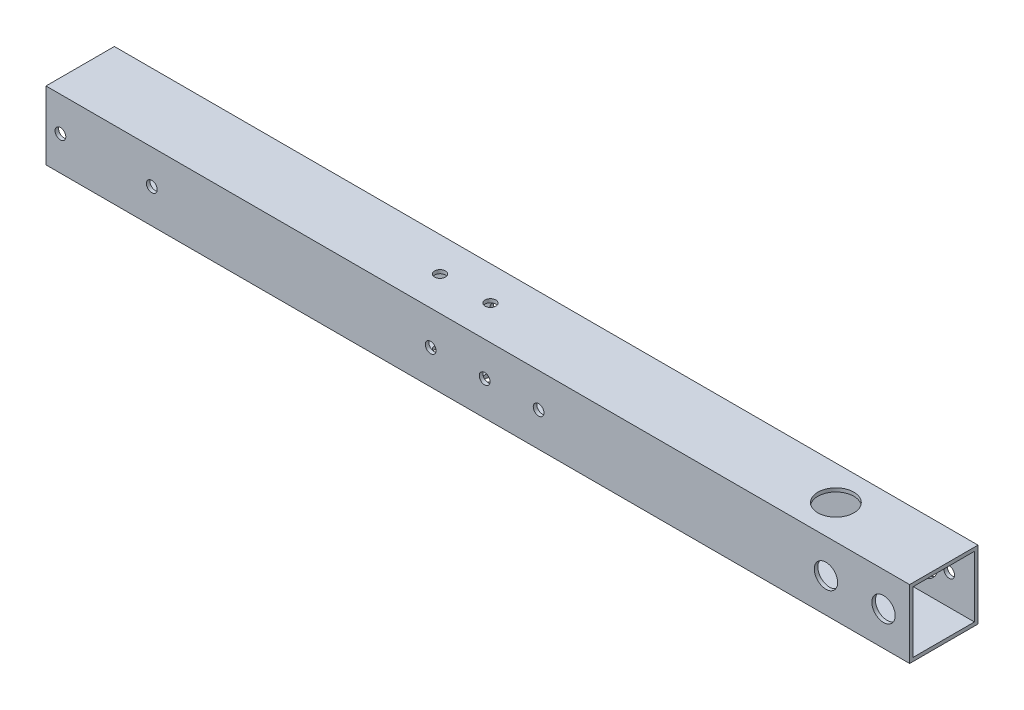
ISO-10303-21;
HEADER;
FILE_DESCRIPTION(('STEP AP214'),'2;1');
FILE_NAME('part.step','',(''),(''),'','','');
FILE_SCHEMA(('AUTOMOTIVE_DESIGN { 1 0 10303 214 1 1 1 1 }'));
ENDSEC;
DATA;
#1=APPLICATION_CONTEXT('core data for automotive mechanical design processes');
#2=APPLICATION_PROTOCOL_DEFINITION('international standard','automotive_design',2000,#1);
#3=PRODUCT_CONTEXT('',#1,'mechanical');
#4=PRODUCT('Part','Part','',(#3));
#5=PRODUCT_RELATED_PRODUCT_CATEGORY('part','',(#4));
#6=PRODUCT_DEFINITION_FORMATION('','',#4);
#7=PRODUCT_DEFINITION_CONTEXT('part definition',#1,'design');
#8=PRODUCT_DEFINITION('design','',#6,#7);
#9=PRODUCT_DEFINITION_SHAPE('','',#8);
#10=(LENGTH_UNIT() NAMED_UNIT(*) SI_UNIT(.MILLI.,.METRE.));
#11=(NAMED_UNIT(*) PLANE_ANGLE_UNIT() SI_UNIT($,.RADIAN.));
#12=(NAMED_UNIT(*) SI_UNIT($,.STERADIAN.) SOLID_ANGLE_UNIT());
#13=UNCERTAINTY_MEASURE_WITH_UNIT(LENGTH_MEASURE(1.E-05),#10,'distance_accuracy_value','');
#14=(GEOMETRIC_REPRESENTATION_CONTEXT(3) GLOBAL_UNCERTAINTY_ASSIGNED_CONTEXT((#13)) GLOBAL_UNIT_ASSIGNED_CONTEXT((#10,
#11,#12)) REPRESENTATION_CONTEXT('',''));
#15=CARTESIAN_POINT('',(0.,0.,0.));
#16=DIRECTION('',(0.,0.,1.));
#17=DIRECTION('',(1.,0.,0.));
#18=AXIS2_PLACEMENT_3D('',#15,#16,#17);
#19=CARTESIAN_POINT('',(240.,0.,0.));
#20=DIRECTION('',(-1.,0.,0.));
#21=DIRECTION('',(0.,0.,1.));
#22=AXIS2_PLACEMENT_3D('',#19,#20,#21);
#23=PLANE('',#22);
#24=DIRECTION('',(0.,1.,0.));
#25=VECTOR('',#24,1.);
#26=CARTESIAN_POINT('',(240.,-9.5,-9.5));
#27=LINE('',#26,#25);
#28=CARTESIAN_POINT('',(240.,-9.5,-9.5));
#29=VERTEX_POINT('',#28);
#30=CARTESIAN_POINT('',(240.,9.5,-9.5));
#31=VERTEX_POINT('',#30);
#32=EDGE_CURVE('E139',#29,#31,#27,.T.);
#33=ORIENTED_EDGE('',*,*,#32,.T.);
#34=DIRECTION('',(0.,0.,1.));
#35=VECTOR('',#34,1.);
#36=CARTESIAN_POINT('',(240.,9.5,9.5));
#37=LINE('',#36,#35);
#38=CARTESIAN_POINT('',(240.,9.5,9.5));
#39=VERTEX_POINT('',#38);
#40=EDGE_CURVE('E142',#31,#39,#37,.T.);
#41=ORIENTED_EDGE('',*,*,#40,.T.);
#42=DIRECTION('',(0.,-1.,0.));
#43=VECTOR('',#42,1.);
#44=CARTESIAN_POINT('',(240.,-9.5,9.5));
#45=LINE('',#44,#43);
#46=CARTESIAN_POINT('',(240.,-9.5,9.5));
#47=VERTEX_POINT('',#46);
#48=EDGE_CURVE('E145',#39,#47,#45,.T.);
#49=ORIENTED_EDGE('',*,*,#48,.T.);
#50=DIRECTION('',(0.,0.,-1.));
#51=VECTOR('',#50,1.);
#52=CARTESIAN_POINT('',(240.,-9.5,9.5));
#53=LINE('',#52,#51);
#54=EDGE_CURVE('E147',#47,#29,#53,.T.);
#55=ORIENTED_EDGE('',*,*,#54,.T.);
#56=EDGE_LOOP('',(#33,#41,#49,#55));
#57=FACE_BOUND('',#56,.T.);
#58=DIRECTION('',(0.,-1.,0.));
#59=VECTOR('',#58,1.);
#60=CARTESIAN_POINT('',(240.,-8.5,8.5));
#61=LINE('',#60,#59);
#62=CARTESIAN_POINT('',(240.,8.5,8.5));
#63=VERTEX_POINT('',#62);
#64=CARTESIAN_POINT('',(240.,-8.5,8.5));
#65=VERTEX_POINT('',#64);
#66=EDGE_CURVE('E101',#63,#65,#61,.T.);
#67=ORIENTED_EDGE('',*,*,#66,.F.);
#68=DIRECTION('',(0.,0.,1.));
#69=VECTOR('',#68,1.);
#70=CARTESIAN_POINT('',(240.,8.5,8.5));
#71=LINE('',#70,#69);
#72=CARTESIAN_POINT('',(240.,8.5,-8.5));
#73=VERTEX_POINT('',#72);
#74=EDGE_CURVE('E123',#73,#63,#71,.T.);
#75=ORIENTED_EDGE('',*,*,#74,.F.);
#76=DIRECTION('',(0.,1.,0.));
#77=VECTOR('',#76,1.);
#78=CARTESIAN_POINT('',(240.,-8.5,-8.5));
#79=LINE('',#78,#77);
#80=CARTESIAN_POINT('',(240.,-8.5,-8.5));
#81=VERTEX_POINT('',#80);
#82=EDGE_CURVE('E121',#81,#73,#79,.T.);
#83=ORIENTED_EDGE('',*,*,#82,.F.);
#84=DIRECTION('',(0.,0.,-1.));
#85=VECTOR('',#84,1.);
#86=CARTESIAN_POINT('',(240.,-8.5,8.5));
#87=LINE('',#86,#85);
#88=EDGE_CURVE('E109',#65,#81,#87,.T.);
#89=ORIENTED_EDGE('',*,*,#88,.F.);
#90=EDGE_LOOP('',(#67,#75,#83,#89));
#91=FACE_BOUND('',#90,.T.);
#92=ADVANCED_FACE('F34',(#57,#91),#23,.F.);
#93=CARTESIAN_POINT('',(0.,0.,0.));
#94=DIRECTION('',(-1.,0.,0.));
#95=DIRECTION('',(0.,0.,1.));
#96=AXIS2_PLACEMENT_3D('',#93,#94,#95);
#97=PLANE('',#96);
#98=DIRECTION('',(0.,1.,0.));
#99=VECTOR('',#98,1.);
#100=CARTESIAN_POINT('',(0.,-9.5,-9.5));
#101=LINE('',#100,#99);
#102=CARTESIAN_POINT('',(0.,-9.5,-9.5));
#103=VERTEX_POINT('',#102);
#104=CARTESIAN_POINT('',(0.,9.5,-9.5));
#105=VERTEX_POINT('',#104);
#106=EDGE_CURVE('E117',#103,#105,#101,.T.);
#107=ORIENTED_EDGE('',*,*,#106,.F.);
#108=DIRECTION('',(0.,0.,-1.));
#109=VECTOR('',#108,1.);
#110=CARTESIAN_POINT('',(0.,-9.5,9.5));
#111=LINE('',#110,#109);
#112=CARTESIAN_POINT('',(0.,-9.5,9.5));
#113=VERTEX_POINT('',#112);
#114=EDGE_CURVE('E143',#113,#103,#111,.T.);
#115=ORIENTED_EDGE('',*,*,#114,.F.);
#116=DIRECTION('',(0.,-1.,0.));
#117=VECTOR('',#116,1.);
#118=CARTESIAN_POINT('',(0.,-9.5,9.5));
#119=LINE('',#118,#117);
#120=CARTESIAN_POINT('',(0.,9.5,9.5));
#121=VERTEX_POINT('',#120);
#122=EDGE_CURVE('E154',#121,#113,#119,.T.);
#123=ORIENTED_EDGE('',*,*,#122,.F.);
#124=DIRECTION('',(0.,0.,1.));
#125=VECTOR('',#124,1.);
#126=CARTESIAN_POINT('',(0.,9.5,9.5));
#127=LINE('',#126,#125);
#128=EDGE_CURVE('E152',#105,#121,#127,.T.);
#129=ORIENTED_EDGE('',*,*,#128,.F.);
#130=EDGE_LOOP('',(#107,#115,#123,#129));
#131=FACE_BOUND('',#130,.T.);
#132=DIRECTION('',(0.,0.,1.));
#133=VECTOR('',#132,1.);
#134=CARTESIAN_POINT('',(0.,8.5,8.5));
#135=LINE('',#134,#133);
#136=CARTESIAN_POINT('',(0.,8.5,-8.5));
#137=VERTEX_POINT('',#136);
#138=CARTESIAN_POINT('',(0.,8.5,8.5));
#139=VERTEX_POINT('',#138);
#140=EDGE_CURVE('E110',#137,#139,#135,.T.);
#141=ORIENTED_EDGE('',*,*,#140,.T.);
#142=DIRECTION('',(0.,-1.,0.));
#143=VECTOR('',#142,1.);
#144=CARTESIAN_POINT('',(0.,-8.5,8.5));
#145=LINE('',#144,#143);
#146=CARTESIAN_POINT('',(0.,-8.5,8.5));
#147=VERTEX_POINT('',#146);
#148=EDGE_CURVE('E59',#139,#147,#145,.T.);
#149=ORIENTED_EDGE('',*,*,#148,.T.);
#150=DIRECTION('',(0.,0.,-1.));
#151=VECTOR('',#150,1.);
#152=CARTESIAN_POINT('',(0.,-8.5,8.5));
#153=LINE('',#152,#151);
#154=CARTESIAN_POINT('',(0.,-8.5,-8.5));
#155=VERTEX_POINT('',#154);
#156=EDGE_CURVE('E116',#147,#155,#153,.T.);
#157=ORIENTED_EDGE('',*,*,#156,.T.);
#158=DIRECTION('',(0.,1.,0.));
#159=VECTOR('',#158,1.);
#160=CARTESIAN_POINT('',(0.,-8.5,-8.5));
#161=LINE('',#160,#159);
#162=EDGE_CURVE('E131',#155,#137,#161,.T.);
#163=ORIENTED_EDGE('',*,*,#162,.T.);
#164=EDGE_LOOP('',(#141,#149,#157,#163));
#165=FACE_BOUND('',#164,.T.);
#166=ADVANCED_FACE('F304',(#131,#165),#97,.T.);
#167=CARTESIAN_POINT('',(240.,-9.5,-9.5));
#168=DIRECTION('',(0.,0.,1.));
#169=DIRECTION('',(1.,0.,0.));
#170=AXIS2_PLACEMENT_3D('',#167,#168,#169);
#171=PLANE('',#170);
#172=CARTESIAN_POINT('',(233.,0.,-9.5));
#173=DIRECTION('',(0.,0.,-1.));
#174=DIRECTION('',(-1.,0.,0.));
#175=AXIS2_PLACEMENT_3D('',#172,#173,#174);
#176=CIRCLE('',#175,1.5);
#177=CARTESIAN_POINT('',(231.5,0.,-9.5));
#178=VERTEX_POINT('',#177);
#179=EDGE_CURVE('E226',#178,#178,#176,.T.);
#180=ORIENTED_EDGE('',*,*,#179,.F.);
#181=EDGE_LOOP('',(#180));
#182=FACE_BOUND('',#181,.T.);
#183=CARTESIAN_POINT('',(217.,0.,-9.5));
#184=DIRECTION('',(0.,0.,-1.));
#185=DIRECTION('',(-1.,0.,0.));
#186=AXIS2_PLACEMENT_3D('',#183,#184,#185);
#187=CIRCLE('',#186,1.5);
#188=CARTESIAN_POINT('',(215.5,0.,-9.5));
#189=VERTEX_POINT('',#188);
#190=EDGE_CURVE('E216',#189,#189,#187,.T.);
#191=ORIENTED_EDGE('',*,*,#190,.F.);
#192=EDGE_LOOP('',(#191));
#193=FACE_BOUND('',#192,.T.);
#194=CARTESIAN_POINT('',(225.,0.,-9.5));
#195=DIRECTION('',(0.,0.,-1.));
#196=DIRECTION('',(-1.,0.,0.));
#197=AXIS2_PLACEMENT_3D('',#194,#195,#196);
#198=CIRCLE('',#197,4.99999999999999);
#199=CARTESIAN_POINT('',(220.,0.,-9.5));
#200=VERTEX_POINT('',#199);
#201=EDGE_CURVE('E213',#200,#200,#198,.T.);
#202=ORIENTED_EDGE('',*,*,#201,.F.);
#203=EDGE_LOOP('',(#202));
#204=FACE_BOUND('',#203,.T.);
#205=CARTESIAN_POINT('',(136.9,0.,-9.5));
#206=DIRECTION('',(0.,0.,1.));
#207=DIRECTION('',(1.,0.,0.));
#208=AXIS2_PLACEMENT_3D('',#205,#206,#207);
#209=CIRCLE('',#208,1.5);
#210=CARTESIAN_POINT('',(138.4,0.,-9.5));
#211=VERTEX_POINT('',#210);
#212=EDGE_CURVE('E187',#211,#211,#209,.T.);
#213=ORIENTED_EDGE('',*,*,#212,.T.);
#214=EDGE_LOOP('',(#213));
#215=FACE_BOUND('',#214,.T.);
#216=CARTESIAN_POINT('',(121.9,0.,-9.5));
#217=DIRECTION('',(0.,0.,1.));
#218=DIRECTION('',(1.,0.,0.));
#219=AXIS2_PLACEMENT_3D('',#216,#217,#218);
#220=CIRCLE('',#219,1.5);
#221=CARTESIAN_POINT('',(123.4,0.,-9.5));
#222=VERTEX_POINT('',#221);
#223=EDGE_CURVE('E182',#222,#222,#220,.T.);
#224=ORIENTED_EDGE('',*,*,#223,.T.);
#225=EDGE_LOOP('',(#224));
#226=FACE_BOUND('',#225,.T.);
#227=CARTESIAN_POINT('',(29.4,0.,-9.5));
#228=DIRECTION('',(0.,0.,1.));
#229=DIRECTION('',(1.,0.,0.));
#230=AXIS2_PLACEMENT_3D('',#227,#228,#229);
#231=CIRCLE('',#230,1.5);
#232=CARTESIAN_POINT('',(30.9,0.,-9.5));
#233=VERTEX_POINT('',#232);
#234=EDGE_CURVE('E177',#233,#233,#231,.T.);
#235=ORIENTED_EDGE('',*,*,#234,.T.);
#236=EDGE_LOOP('',(#235));
#237=FACE_BOUND('',#236,.T.);
#238=CARTESIAN_POINT('',(106.9,0.,-9.5));
#239=DIRECTION('',(0.,0.,1.));
#240=DIRECTION('',(1.,0.,0.));
#241=AXIS2_PLACEMENT_3D('',#238,#239,#240);
#242=CIRCLE('',#241,1.5);
#243=CARTESIAN_POINT('',(108.4,0.,-9.5));
#244=VERTEX_POINT('',#243);
#245=EDGE_CURVE('E172',#244,#244,#242,.T.);
#246=ORIENTED_EDGE('',*,*,#245,.T.);
#247=EDGE_LOOP('',(#246));
#248=FACE_BOUND('',#247,.T.);
#249=CARTESIAN_POINT('',(4.,0.,-9.5));
#250=DIRECTION('',(0.,0.,1.));
#251=DIRECTION('',(1.,0.,0.));
#252=AXIS2_PLACEMENT_3D('',#249,#250,#251);
#253=CIRCLE('',#252,1.5);
#254=CARTESIAN_POINT('',(5.5,0.,-9.5));
#255=VERTEX_POINT('',#254);
#256=EDGE_CURVE('E167',#255,#255,#253,.T.);
#257=ORIENTED_EDGE('',*,*,#256,.T.);
#258=EDGE_LOOP('',(#257));
#259=FACE_BOUND('',#258,.T.);
#260=ORIENTED_EDGE('',*,*,#106,.T.);
#261=DIRECTION('',(-1.,0.,0.));
#262=VECTOR('',#261,1.);
#263=CARTESIAN_POINT('',(240.,9.5,-9.5));
#264=LINE('',#263,#262);
#265=EDGE_CURVE('E11',#31,#105,#264,.T.);
#266=ORIENTED_EDGE('',*,*,#265,.F.);
#267=ORIENTED_EDGE('',*,*,#32,.F.);
#268=DIRECTION('',(-1.,0.,0.));
#269=VECTOR('',#268,1.);
#270=CARTESIAN_POINT('',(240.,-9.5,-9.5));
#271=LINE('',#270,#269);
#272=EDGE_CURVE('E149',#29,#103,#271,.T.);
#273=ORIENTED_EDGE('',*,*,#272,.T.);
#274=EDGE_LOOP('',(#260,#266,#267,#273));
#275=FACE_BOUND('',#274,.T.);
#276=ADVANCED_FACE('F36',(#182,#193,#204,#215,#226,#237,#248,#259,#275),#171,.F.);
#277=CARTESIAN_POINT('',(240.,9.5,9.5));
#278=DIRECTION('',(0.,-1.,0.));
#279=DIRECTION('',(0.,0.,-1.));
#280=AXIS2_PLACEMENT_3D('',#277,#278,#279);
#281=PLANE('',#280);
#282=CARTESIAN_POINT('',(210.,9.5,0.));
#283=DIRECTION('',(0.,1.,0.));
#284=DIRECTION('',(0.,0.,1.));
#285=AXIS2_PLACEMENT_3D('',#282,#283,#284);
#286=CIRCLE('',#285,4.99999999999999);
#287=CARTESIAN_POINT('',(210.,9.5,4.99999999999999));
#288=VERTEX_POINT('',#287);
#289=EDGE_CURVE('E202',#288,#288,#286,.T.);
#290=ORIENTED_EDGE('',*,*,#289,.F.);
#291=EDGE_LOOP('',(#290));
#292=FACE_BOUND('',#291,.T.);
#293=CARTESIAN_POINT('',(114.,9.5,0.));
#294=DIRECTION('',(0.,1.,0.));
#295=DIRECTION('',(0.,0.,1.));
#296=AXIS2_PLACEMENT_3D('',#293,#294,#295);
#297=CIRCLE('',#296,1.5);
#298=CARTESIAN_POINT('',(114.,9.5,1.50000000000001));
#299=VERTEX_POINT('',#298);
#300=EDGE_CURVE('E201',#299,#299,#297,.T.);
#301=ORIENTED_EDGE('',*,*,#300,.F.);
#302=EDGE_LOOP('',(#301));
#303=FACE_BOUND('',#302,.T.);
#304=CARTESIAN_POINT('',(100.,9.5,0.));
#305=DIRECTION('',(0.,1.,0.));
#306=DIRECTION('',(0.,0.,1.));
#307=AXIS2_PLACEMENT_3D('',#304,#305,#306);
#308=CIRCLE('',#307,1.5);
#309=CARTESIAN_POINT('',(100.,9.5,1.50000000000001));
#310=VERTEX_POINT('',#309);
#311=EDGE_CURVE('E241',#310,#310,#308,.T.);
#312=ORIENTED_EDGE('',*,*,#311,.F.);
#313=EDGE_LOOP('',(#312));
#314=FACE_BOUND('',#313,.T.);
#315=ORIENTED_EDGE('',*,*,#128,.T.);
#316=DIRECTION('',(-1.,0.,0.));
#317=VECTOR('',#316,1.);
#318=CARTESIAN_POINT('',(240.,9.5,9.5));
#319=LINE('',#318,#317);
#320=EDGE_CURVE('E43',#39,#121,#319,.T.);
#321=ORIENTED_EDGE('',*,*,#320,.F.);
#322=ORIENTED_EDGE('',*,*,#40,.F.);
#323=ORIENTED_EDGE('',*,*,#265,.T.);
#324=EDGE_LOOP('',(#315,#321,#322,#323));
#325=FACE_BOUND('',#324,.T.);
#326=ADVANCED_FACE('F313',(#292,#303,#314,#325),#281,.F.);
#327=CARTESIAN_POINT('',(240.,-9.5,9.5));
#328=DIRECTION('',(0.,0.,-1.));
#329=DIRECTION('',(-1.,0.,0.));
#330=AXIS2_PLACEMENT_3D('',#327,#328,#329);
#331=PLANE('',#330);
#332=CARTESIAN_POINT('',(216.75,-1.13462126318957E-13,9.5));
#333=DIRECTION('',(0.,0.,1.));
#334=DIRECTION('',(1.,0.,0.));
#335=AXIS2_PLACEMENT_3D('',#332,#333,#334);
#336=CIRCLE('',#335,3.25000000000001);
#337=CARTESIAN_POINT('',(220.,-1.13462126318957E-13,9.5));
#338=VERTEX_POINT('',#337);
#339=EDGE_CURVE('E210',#338,#338,#336,.T.);
#340=ORIENTED_EDGE('',*,*,#339,.F.);
#341=EDGE_LOOP('',(#340));
#342=FACE_BOUND('',#341,.T.);
#343=CARTESIAN_POINT('',(232.75,0.,9.5));
#344=DIRECTION('',(0.,0.,1.));
#345=DIRECTION('',(1.,0.,0.));
#346=AXIS2_PLACEMENT_3D('',#343,#344,#345);
#347=CIRCLE('',#346,3.25000000000001);
#348=CARTESIAN_POINT('',(236.,0.,9.5));
#349=VERTEX_POINT('',#348);
#350=EDGE_CURVE('E206',#349,#349,#347,.T.);
#351=ORIENTED_EDGE('',*,*,#350,.F.);
#352=EDGE_LOOP('',(#351));
#353=FACE_BOUND('',#352,.T.);
#354=CARTESIAN_POINT('',(136.9,0.,9.5));
#355=DIRECTION('',(0.,0.,1.));
#356=DIRECTION('',(1.,0.,0.));
#357=AXIS2_PLACEMENT_3D('',#354,#355,#356);
#358=CIRCLE('',#357,1.5);
#359=CARTESIAN_POINT('',(138.4,0.,9.5));
#360=VERTEX_POINT('',#359);
#361=EDGE_CURVE('E248',#360,#360,#358,.T.);
#362=ORIENTED_EDGE('',*,*,#361,.F.);
#363=EDGE_LOOP('',(#362));
#364=FACE_BOUND('',#363,.T.);
#365=CARTESIAN_POINT('',(121.9,0.,9.5));
#366=DIRECTION('',(0.,0.,1.));
#367=DIRECTION('',(1.,0.,0.));
#368=AXIS2_PLACEMENT_3D('',#365,#366,#367);
#369=CIRCLE('',#368,1.5);
#370=CARTESIAN_POINT('',(123.4,0.,9.5));
#371=VERTEX_POINT('',#370);
#372=EDGE_CURVE('E255',#371,#371,#369,.T.);
#373=ORIENTED_EDGE('',*,*,#372,.F.);
#374=EDGE_LOOP('',(#373));
#375=FACE_BOUND('',#374,.T.);
#376=CARTESIAN_POINT('',(29.4,0.,9.5));
#377=DIRECTION('',(0.,0.,1.));
#378=DIRECTION('',(1.,0.,0.));
#379=AXIS2_PLACEMENT_3D('',#376,#377,#378);
#380=CIRCLE('',#379,1.5);
#381=CARTESIAN_POINT('',(30.9,0.,9.5));
#382=VERTEX_POINT('',#381);
#383=EDGE_CURVE('E262',#382,#382,#380,.T.);
#384=ORIENTED_EDGE('',*,*,#383,.F.);
#385=EDGE_LOOP('',(#384));
#386=FACE_BOUND('',#385,.T.);
#387=CARTESIAN_POINT('',(106.9,0.,9.5));
#388=DIRECTION('',(0.,0.,1.));
#389=DIRECTION('',(1.,0.,0.));
#390=AXIS2_PLACEMENT_3D('',#387,#388,#389);
#391=CIRCLE('',#390,1.5);
#392=CARTESIAN_POINT('',(108.4,0.,9.5));
#393=VERTEX_POINT('',#392);
#394=EDGE_CURVE('E269',#393,#393,#391,.T.);
#395=ORIENTED_EDGE('',*,*,#394,.F.);
#396=EDGE_LOOP('',(#395));
#397=FACE_BOUND('',#396,.T.);
#398=CARTESIAN_POINT('',(4.,0.,9.5));
#399=DIRECTION('',(0.,0.,1.));
#400=DIRECTION('',(1.,0.,0.));
#401=AXIS2_PLACEMENT_3D('',#398,#399,#400);
#402=CIRCLE('',#401,1.5);
#403=CARTESIAN_POINT('',(5.5,0.,9.5));
#404=VERTEX_POINT('',#403);
#405=EDGE_CURVE('E276',#404,#404,#402,.T.);
#406=ORIENTED_EDGE('',*,*,#405,.F.);
#407=EDGE_LOOP('',(#406));
#408=FACE_BOUND('',#407,.T.);
#409=ORIENTED_EDGE('',*,*,#122,.T.);
#410=DIRECTION('',(-1.,0.,0.));
#411=VECTOR('',#410,1.);
#412=CARTESIAN_POINT('',(240.,-9.5,9.5));
#413=LINE('',#412,#411);
#414=EDGE_CURVE('E159',#47,#113,#413,.T.);
#415=ORIENTED_EDGE('',*,*,#414,.F.);
#416=ORIENTED_EDGE('',*,*,#48,.F.);
#417=ORIENTED_EDGE('',*,*,#320,.T.);
#418=EDGE_LOOP('',(#409,#415,#416,#417));
#419=FACE_BOUND('',#418,.T.);
#420=ADVANCED_FACE('F297',(#342,#353,#364,#375,#386,#397,#408,#419),#331,.F.);
#421=CARTESIAN_POINT('',(240.,-9.5,9.5));
#422=DIRECTION('',(0.,1.,0.));
#423=DIRECTION('',(0.,0.,1.));
#424=AXIS2_PLACEMENT_3D('',#421,#422,#423);
#425=PLANE('',#424);
#426=CARTESIAN_POINT('',(114.,-9.5,0.));
#427=DIRECTION('',(0.,1.,0.));
#428=DIRECTION('',(0.,0.,1.));
#429=AXIS2_PLACEMENT_3D('',#426,#427,#428);
#430=CIRCLE('',#429,1.5);
#431=CARTESIAN_POINT('',(114.,-9.5,1.50000000000001));
#432=VERTEX_POINT('',#431);
#433=EDGE_CURVE('E197',#432,#432,#430,.T.);
#434=ORIENTED_EDGE('',*,*,#433,.T.);
#435=EDGE_LOOP('',(#434));
#436=FACE_BOUND('',#435,.T.);
#437=CARTESIAN_POINT('',(100.,-9.5,0.));
#438=DIRECTION('',(0.,1.,0.));
#439=DIRECTION('',(0.,0.,1.));
#440=AXIS2_PLACEMENT_3D('',#437,#438,#439);
#441=CIRCLE('',#440,1.5);
#442=CARTESIAN_POINT('',(100.,-9.5,1.50000000000001));
#443=VERTEX_POINT('',#442);
#444=EDGE_CURVE('E192',#443,#443,#441,.T.);
#445=ORIENTED_EDGE('',*,*,#444,.T.);
#446=EDGE_LOOP('',(#445));
#447=FACE_BOUND('',#446,.T.);
#448=ORIENTED_EDGE('',*,*,#114,.T.);
#449=ORIENTED_EDGE('',*,*,#272,.F.);
#450=ORIENTED_EDGE('',*,*,#54,.F.);
#451=ORIENTED_EDGE('',*,*,#414,.T.);
#452=EDGE_LOOP('',(#448,#449,#450,#451));
#453=FACE_BOUND('',#452,.T.);
#454=ADVANCED_FACE('F287',(#436,#447,#453),#425,.F.);
#455=CARTESIAN_POINT('',(240.,-8.5,8.5));
#456=DIRECTION('',(0.,0.,-1.));
#457=DIRECTION('',(-1.,0.,0.));
#458=AXIS2_PLACEMENT_3D('',#455,#456,#457);
#459=PLANE('',#458);
#460=CARTESIAN_POINT('',(216.75,-1.13462126318957E-13,8.5));
#461=DIRECTION('',(0.,0.,-1.));
#462=DIRECTION('',(-1.,0.,0.));
#463=AXIS2_PLACEMENT_3D('',#460,#461,#462);
#464=CIRCLE('',#463,3.25000000000001);
#465=CARTESIAN_POINT('',(213.5,-1.13462126318957E-13,8.5));
#466=VERTEX_POINT('',#465);
#467=EDGE_CURVE('E207',#466,#466,#464,.T.);
#468=ORIENTED_EDGE('',*,*,#467,.F.);
#469=EDGE_LOOP('',(#468));
#470=FACE_BOUND('',#469,.T.);
#471=CARTESIAN_POINT('',(232.75,0.,8.5));
#472=DIRECTION('',(0.,0.,-1.));
#473=DIRECTION('',(-1.,0.,0.));
#474=AXIS2_PLACEMENT_3D('',#471,#472,#473);
#475=CIRCLE('',#474,3.25000000000001);
#476=CARTESIAN_POINT('',(229.5,0.,8.5));
#477=VERTEX_POINT('',#476);
#478=EDGE_CURVE('E203',#477,#477,#475,.T.);
#479=ORIENTED_EDGE('',*,*,#478,.F.);
#480=EDGE_LOOP('',(#479));
#481=FACE_BOUND('',#480,.T.);
#482=CARTESIAN_POINT('',(136.9,0.,8.5));
#483=DIRECTION('',(0.,0.,-1.));
#484=DIRECTION('',(-1.,0.,0.));
#485=AXIS2_PLACEMENT_3D('',#482,#483,#484);
#486=CIRCLE('',#485,1.5);
#487=CARTESIAN_POINT('',(135.4,0.,8.5));
#488=VERTEX_POINT('',#487);
#489=EDGE_CURVE('E186',#488,#488,#486,.T.);
#490=ORIENTED_EDGE('',*,*,#489,.F.);
#491=EDGE_LOOP('',(#490));
#492=FACE_BOUND('',#491,.T.);
#493=CARTESIAN_POINT('',(121.9,0.,8.5));
#494=DIRECTION('',(0.,0.,-1.));
#495=DIRECTION('',(-1.,0.,0.));
#496=AXIS2_PLACEMENT_3D('',#493,#494,#495);
#497=CIRCLE('',#496,1.5);
#498=CARTESIAN_POINT('',(120.4,0.,8.5));
#499=VERTEX_POINT('',#498);
#500=EDGE_CURVE('E181',#499,#499,#497,.T.);
#501=ORIENTED_EDGE('',*,*,#500,.F.);
#502=EDGE_LOOP('',(#501));
#503=FACE_BOUND('',#502,.T.);
#504=CARTESIAN_POINT('',(29.4,0.,8.5));
#505=DIRECTION('',(0.,0.,-1.));
#506=DIRECTION('',(-1.,0.,0.));
#507=AXIS2_PLACEMENT_3D('',#504,#505,#506);
#508=CIRCLE('',#507,1.5);
#509=CARTESIAN_POINT('',(27.9,0.,8.5));
#510=VERTEX_POINT('',#509);
#511=EDGE_CURVE('E176',#510,#510,#508,.T.);
#512=ORIENTED_EDGE('',*,*,#511,.F.);
#513=EDGE_LOOP('',(#512));
#514=FACE_BOUND('',#513,.T.);
#515=CARTESIAN_POINT('',(106.9,0.,8.5));
#516=DIRECTION('',(0.,0.,-1.));
#517=DIRECTION('',(-1.,0.,0.));
#518=AXIS2_PLACEMENT_3D('',#515,#516,#517);
#519=CIRCLE('',#518,1.5);
#520=CARTESIAN_POINT('',(105.4,0.,8.5));
#521=VERTEX_POINT('',#520);
#522=EDGE_CURVE('E171',#521,#521,#519,.T.);
#523=ORIENTED_EDGE('',*,*,#522,.F.);
#524=EDGE_LOOP('',(#523));
#525=FACE_BOUND('',#524,.T.);
#526=CARTESIAN_POINT('',(4.,0.,8.5));
#527=DIRECTION('',(0.,0.,-1.));
#528=DIRECTION('',(-1.,0.,0.));
#529=AXIS2_PLACEMENT_3D('',#526,#527,#528);
#530=CIRCLE('',#529,1.5);
#531=CARTESIAN_POINT('',(2.5,0.,8.5));
#532=VERTEX_POINT('',#531);
#533=EDGE_CURVE('E129',#532,#532,#530,.T.);
#534=ORIENTED_EDGE('',*,*,#533,.F.);
#535=EDGE_LOOP('',(#534));
#536=FACE_BOUND('',#535,.T.);
#537=ORIENTED_EDGE('',*,*,#148,.F.);
#538=DIRECTION('',(-1.,0.,0.));
#539=VECTOR('',#538,1.);
#540=CARTESIAN_POINT('',(240.,8.5,8.5));
#541=LINE('',#540,#539);
#542=EDGE_CURVE('E105',#63,#139,#541,.T.);
#543=ORIENTED_EDGE('',*,*,#542,.F.);
#544=ORIENTED_EDGE('',*,*,#66,.T.);
#545=DIRECTION('',(-1.,0.,0.));
#546=VECTOR('',#545,1.);
#547=CARTESIAN_POINT('',(240.,-8.5,8.5));
#548=LINE('',#547,#546);
#549=EDGE_CURVE('E104',#65,#147,#548,.T.);
#550=ORIENTED_EDGE('',*,*,#549,.T.);
#551=EDGE_LOOP('',(#537,#543,#544,#550));
#552=FACE_BOUND('',#551,.T.);
#553=ADVANCED_FACE('F103',(#470,#481,#492,#503,#514,#525,#536,#552),#459,.T.);
#554=CARTESIAN_POINT('',(240.,-8.5,8.5));
#555=DIRECTION('',(0.,1.,0.));
#556=DIRECTION('',(0.,0.,1.));
#557=AXIS2_PLACEMENT_3D('',#554,#555,#556);
#558=PLANE('',#557);
#559=CARTESIAN_POINT('',(114.,-8.5,0.));
#560=DIRECTION('',(0.,1.,0.));
#561=DIRECTION('',(0.,0.,1.));
#562=AXIS2_PLACEMENT_3D('',#559,#560,#561);
#563=CIRCLE('',#562,1.5);
#564=CARTESIAN_POINT('',(114.,-8.5,1.50000000000001));
#565=VERTEX_POINT('',#564);
#566=EDGE_CURVE('E196',#565,#565,#563,.T.);
#567=ORIENTED_EDGE('',*,*,#566,.F.);
#568=EDGE_LOOP('',(#567));
#569=FACE_BOUND('',#568,.T.);
#570=CARTESIAN_POINT('',(100.,-8.5,0.));
#571=DIRECTION('',(0.,1.,0.));
#572=DIRECTION('',(0.,0.,1.));
#573=AXIS2_PLACEMENT_3D('',#570,#571,#572);
#574=CIRCLE('',#573,1.5);
#575=CARTESIAN_POINT('',(100.,-8.5,1.50000000000001));
#576=VERTEX_POINT('',#575);
#577=EDGE_CURVE('E191',#576,#576,#574,.T.);
#578=ORIENTED_EDGE('',*,*,#577,.F.);
#579=EDGE_LOOP('',(#578));
#580=FACE_BOUND('',#579,.T.);
#581=ORIENTED_EDGE('',*,*,#156,.F.);
#582=ORIENTED_EDGE('',*,*,#549,.F.);
#583=ORIENTED_EDGE('',*,*,#88,.T.);
#584=DIRECTION('',(-1.,0.,0.));
#585=VECTOR('',#584,1.);
#586=CARTESIAN_POINT('',(240.,-8.5,-8.5));
#587=LINE('',#586,#585);
#588=EDGE_CURVE('E118',#81,#155,#587,.T.);
#589=ORIENTED_EDGE('',*,*,#588,.T.);
#590=EDGE_LOOP('',(#581,#582,#583,#589));
#591=FACE_BOUND('',#590,.T.);
#592=ADVANCED_FACE('F113',(#569,#580,#591),#558,.T.);
#593=CARTESIAN_POINT('',(240.,-8.5,-8.5));
#594=DIRECTION('',(0.,0.,1.));
#595=DIRECTION('',(1.,0.,0.));
#596=AXIS2_PLACEMENT_3D('',#593,#594,#595);
#597=PLANE('',#596);
#598=CARTESIAN_POINT('',(233.,0.,-8.5));
#599=DIRECTION('',(0.,0.,1.));
#600=DIRECTION('',(1.,0.,0.));
#601=AXIS2_PLACEMENT_3D('',#598,#599,#600);
#602=CIRCLE('',#601,1.5);
#603=CARTESIAN_POINT('',(234.5,0.,-8.5));
#604=VERTEX_POINT('',#603);
#605=EDGE_CURVE('E38',#604,#604,#602,.T.);
#606=ORIENTED_EDGE('',*,*,#605,.F.);
#607=EDGE_LOOP('',(#606));
#608=FACE_BOUND('',#607,.T.);
#609=CARTESIAN_POINT('',(217.,0.,-8.5));
#610=DIRECTION('',(0.,0.,1.));
#611=DIRECTION('',(1.,0.,0.));
#612=AXIS2_PLACEMENT_3D('',#609,#610,#611);
#613=CIRCLE('',#612,1.5);
#614=CARTESIAN_POINT('',(218.5,0.,-8.5));
#615=VERTEX_POINT('',#614);
#616=EDGE_CURVE('E214',#615,#615,#613,.T.);
#617=ORIENTED_EDGE('',*,*,#616,.F.);
#618=EDGE_LOOP('',(#617));
#619=FACE_BOUND('',#618,.T.);
#620=CARTESIAN_POINT('',(225.,0.,-8.5));
#621=DIRECTION('',(0.,0.,1.));
#622=DIRECTION('',(1.,0.,0.));
#623=AXIS2_PLACEMENT_3D('',#620,#621,#622);
#624=CIRCLE('',#623,4.99999999999999);
#625=CARTESIAN_POINT('',(230.,0.,-8.5));
#626=VERTEX_POINT('',#625);
#627=EDGE_CURVE('E211',#626,#626,#624,.T.);
#628=ORIENTED_EDGE('',*,*,#627,.F.);
#629=EDGE_LOOP('',(#628));
#630=FACE_BOUND('',#629,.T.);
#631=CARTESIAN_POINT('',(136.9,0.,-8.5));
#632=DIRECTION('',(0.,0.,1.));
#633=DIRECTION('',(1.,0.,0.));
#634=AXIS2_PLACEMENT_3D('',#631,#632,#633);
#635=CIRCLE('',#634,1.5);
#636=CARTESIAN_POINT('',(138.4,0.,-8.5));
#637=VERTEX_POINT('',#636);
#638=EDGE_CURVE('E183',#637,#637,#635,.T.);
#639=ORIENTED_EDGE('',*,*,#638,.F.);
#640=EDGE_LOOP('',(#639));
#641=FACE_BOUND('',#640,.T.);
#642=CARTESIAN_POINT('',(121.9,0.,-8.5));
#643=DIRECTION('',(0.,0.,1.));
#644=DIRECTION('',(1.,0.,0.));
#645=AXIS2_PLACEMENT_3D('',#642,#643,#644);
#646=CIRCLE('',#645,1.5);
#647=CARTESIAN_POINT('',(123.4,0.,-8.5));
#648=VERTEX_POINT('',#647);
#649=EDGE_CURVE('E178',#648,#648,#646,.T.);
#650=ORIENTED_EDGE('',*,*,#649,.F.);
#651=EDGE_LOOP('',(#650));
#652=FACE_BOUND('',#651,.T.);
#653=CARTESIAN_POINT('',(29.4,0.,-8.5));
#654=DIRECTION('',(0.,0.,1.));
#655=DIRECTION('',(1.,0.,0.));
#656=AXIS2_PLACEMENT_3D('',#653,#654,#655);
#657=CIRCLE('',#656,1.5);
#658=CARTESIAN_POINT('',(30.9,0.,-8.5));
#659=VERTEX_POINT('',#658);
#660=EDGE_CURVE('E173',#659,#659,#657,.T.);
#661=ORIENTED_EDGE('',*,*,#660,.F.);
#662=EDGE_LOOP('',(#661));
#663=FACE_BOUND('',#662,.T.);
#664=CARTESIAN_POINT('',(106.9,0.,-8.5));
#665=DIRECTION('',(0.,0.,1.));
#666=DIRECTION('',(1.,0.,0.));
#667=AXIS2_PLACEMENT_3D('',#664,#665,#666);
#668=CIRCLE('',#667,1.5);
#669=CARTESIAN_POINT('',(108.4,0.,-8.5));
#670=VERTEX_POINT('',#669);
#671=EDGE_CURVE('E168',#670,#670,#668,.T.);
#672=ORIENTED_EDGE('',*,*,#671,.F.);
#673=EDGE_LOOP('',(#672));
#674=FACE_BOUND('',#673,.T.);
#675=CARTESIAN_POINT('',(4.,0.,-8.5));
#676=DIRECTION('',(0.,0.,1.));
#677=DIRECTION('',(1.,0.,0.));
#678=AXIS2_PLACEMENT_3D('',#675,#676,#677);
#679=CIRCLE('',#678,1.5);
#680=CARTESIAN_POINT('',(5.5,0.,-8.5));
#681=VERTEX_POINT('',#680);
#682=EDGE_CURVE('E164',#681,#681,#679,.T.);
#683=ORIENTED_EDGE('',*,*,#682,.F.);
#684=EDGE_LOOP('',(#683));
#685=FACE_BOUND('',#684,.T.);
#686=ORIENTED_EDGE('',*,*,#162,.F.);
#687=ORIENTED_EDGE('',*,*,#588,.F.);
#688=ORIENTED_EDGE('',*,*,#82,.T.);
#689=DIRECTION('',(-1.,0.,0.));
#690=VECTOR('',#689,1.);
#691=CARTESIAN_POINT('',(240.,8.5,-8.5));
#692=LINE('',#691,#690);
#693=EDGE_CURVE('E51',#73,#137,#692,.T.);
#694=ORIENTED_EDGE('',*,*,#693,.T.);
#695=EDGE_LOOP('',(#686,#687,#688,#694));
#696=FACE_BOUND('',#695,.T.);
#697=ADVANCED_FACE('F294',(#608,#619,#630,#641,#652,#663,#674,#685,#696),#597,.T.);
#698=CARTESIAN_POINT('',(240.,8.5,8.5));
#699=DIRECTION('',(0.,-1.,0.));
#700=DIRECTION('',(0.,0.,-1.));
#701=AXIS2_PLACEMENT_3D('',#698,#699,#700);
#702=PLANE('',#701);
#703=CARTESIAN_POINT('',(210.,8.5,0.));
#704=DIRECTION('',(0.,-1.,0.));
#705=DIRECTION('',(0.,0.,-1.));
#706=AXIS2_PLACEMENT_3D('',#703,#704,#705);
#707=CIRCLE('',#706,4.99999999999999);
#708=CARTESIAN_POINT('',(210.,8.5,-4.99999999999998));
#709=VERTEX_POINT('',#708);
#710=EDGE_CURVE('E198',#709,#709,#707,.T.);
#711=ORIENTED_EDGE('',*,*,#710,.F.);
#712=EDGE_LOOP('',(#711));
#713=FACE_BOUND('',#712,.T.);
#714=CARTESIAN_POINT('',(114.,8.5,0.));
#715=DIRECTION('',(0.,-1.,0.));
#716=DIRECTION('',(0.,0.,-1.));
#717=AXIS2_PLACEMENT_3D('',#714,#715,#716);
#718=CIRCLE('',#717,1.5);
#719=CARTESIAN_POINT('',(114.,8.5,-1.49999999999998));
#720=VERTEX_POINT('',#719);
#721=EDGE_CURVE('E193',#720,#720,#718,.T.);
#722=ORIENTED_EDGE('',*,*,#721,.F.);
#723=EDGE_LOOP('',(#722));
#724=FACE_BOUND('',#723,.T.);
#725=CARTESIAN_POINT('',(100.,8.5,0.));
#726=DIRECTION('',(0.,-1.,0.));
#727=DIRECTION('',(0.,0.,-1.));
#728=AXIS2_PLACEMENT_3D('',#725,#726,#727);
#729=CIRCLE('',#728,1.5);
#730=CARTESIAN_POINT('',(100.,8.5,-1.49999999999998));
#731=VERTEX_POINT('',#730);
#732=EDGE_CURVE('E188',#731,#731,#729,.T.);
#733=ORIENTED_EDGE('',*,*,#732,.F.);
#734=EDGE_LOOP('',(#733));
#735=FACE_BOUND('',#734,.T.);
#736=ORIENTED_EDGE('',*,*,#140,.F.);
#737=ORIENTED_EDGE('',*,*,#693,.F.);
#738=ORIENTED_EDGE('',*,*,#74,.T.);
#739=ORIENTED_EDGE('',*,*,#542,.T.);
#740=EDGE_LOOP('',(#736,#737,#738,#739));
#741=FACE_BOUND('',#740,.T.);
#742=ADVANCED_FACE('F342',(#713,#724,#735,#741),#702,.T.);
#743=CARTESIAN_POINT('',(4.,0.,-9.5));
#744=DIRECTION('',(0.,0.,1.));
#745=DIRECTION('',(1.,0.,0.));
#746=AXIS2_PLACEMENT_3D('',#743,#744,#745);
#747=CYLINDRICAL_SURFACE('',#746,1.5);
#748=ORIENTED_EDGE('',*,*,#682,.T.);
#749=EDGE_LOOP('',(#748));
#750=FACE_BOUND('',#749,.T.);
#751=ORIENTED_EDGE('',*,*,#256,.F.);
#752=EDGE_LOOP('',(#751));
#753=FACE_BOUND('',#752,.T.);
#754=ADVANCED_FACE('F344',(#750,#753),#747,.F.);
#755=ORIENTED_EDGE('',*,*,#533,.T.);
#756=EDGE_LOOP('',(#755));
#757=FACE_BOUND('',#756,.T.);
#758=ORIENTED_EDGE('',*,*,#405,.T.);
#759=EDGE_LOOP('',(#758));
#760=FACE_BOUND('',#759,.T.);
#761=ADVANCED_FACE('F283',(#757,#760),#747,.F.);
#762=CARTESIAN_POINT('',(106.9,0.,-9.5));
#763=DIRECTION('',(0.,0.,1.));
#764=DIRECTION('',(1.,0.,0.));
#765=AXIS2_PLACEMENT_3D('',#762,#763,#764);
#766=CYLINDRICAL_SURFACE('',#765,1.5);
#767=ORIENTED_EDGE('',*,*,#671,.T.);
#768=EDGE_LOOP('',(#767));
#769=FACE_BOUND('',#768,.T.);
#770=ORIENTED_EDGE('',*,*,#245,.F.);
#771=EDGE_LOOP('',(#770));
#772=FACE_BOUND('',#771,.T.);
#773=ADVANCED_FACE('F358',(#769,#772),#766,.F.);
#774=ORIENTED_EDGE('',*,*,#522,.T.);
#775=EDGE_LOOP('',(#774));
#776=FACE_BOUND('',#775,.T.);
#777=ORIENTED_EDGE('',*,*,#394,.T.);
#778=EDGE_LOOP('',(#777));
#779=FACE_BOUND('',#778,.T.);
#780=ADVANCED_FACE('F361',(#776,#779),#766,.F.);
#781=CARTESIAN_POINT('',(29.4,0.,-9.5));
#782=DIRECTION('',(0.,0.,1.));
#783=DIRECTION('',(1.,0.,0.));
#784=AXIS2_PLACEMENT_3D('',#781,#782,#783);
#785=CYLINDRICAL_SURFACE('',#784,1.5);
#786=ORIENTED_EDGE('',*,*,#660,.T.);
#787=EDGE_LOOP('',(#786));
#788=FACE_BOUND('',#787,.T.);
#789=ORIENTED_EDGE('',*,*,#234,.F.);
#790=EDGE_LOOP('',(#789));
#791=FACE_BOUND('',#790,.T.);
#792=ADVANCED_FACE('F363',(#788,#791),#785,.F.);
#793=ORIENTED_EDGE('',*,*,#511,.T.);
#794=EDGE_LOOP('',(#793));
#795=FACE_BOUND('',#794,.T.);
#796=ORIENTED_EDGE('',*,*,#383,.T.);
#797=EDGE_LOOP('',(#796));
#798=FACE_BOUND('',#797,.T.);
#799=ADVANCED_FACE('F366',(#795,#798),#785,.F.);
#800=CARTESIAN_POINT('',(121.9,0.,-9.5));
#801=DIRECTION('',(0.,0.,1.));
#802=DIRECTION('',(1.,0.,0.));
#803=AXIS2_PLACEMENT_3D('',#800,#801,#802);
#804=CYLINDRICAL_SURFACE('',#803,1.5);
#805=ORIENTED_EDGE('',*,*,#649,.T.);
#806=EDGE_LOOP('',(#805));
#807=FACE_BOUND('',#806,.T.);
#808=ORIENTED_EDGE('',*,*,#223,.F.);
#809=EDGE_LOOP('',(#808));
#810=FACE_BOUND('',#809,.T.);
#811=ADVANCED_FACE('F368',(#807,#810),#804,.F.);
#812=ORIENTED_EDGE('',*,*,#500,.T.);
#813=EDGE_LOOP('',(#812));
#814=FACE_BOUND('',#813,.T.);
#815=ORIENTED_EDGE('',*,*,#372,.T.);
#816=EDGE_LOOP('',(#815));
#817=FACE_BOUND('',#816,.T.);
#818=ADVANCED_FACE('F371',(#814,#817),#804,.F.);
#819=CARTESIAN_POINT('',(136.9,0.,-9.5));
#820=DIRECTION('',(0.,0.,1.));
#821=DIRECTION('',(1.,0.,0.));
#822=AXIS2_PLACEMENT_3D('',#819,#820,#821);
#823=CYLINDRICAL_SURFACE('',#822,1.5);
#824=ORIENTED_EDGE('',*,*,#638,.T.);
#825=EDGE_LOOP('',(#824));
#826=FACE_BOUND('',#825,.T.);
#827=ORIENTED_EDGE('',*,*,#212,.F.);
#828=EDGE_LOOP('',(#827));
#829=FACE_BOUND('',#828,.T.);
#830=ADVANCED_FACE('F373',(#826,#829),#823,.F.);
#831=ORIENTED_EDGE('',*,*,#489,.T.);
#832=EDGE_LOOP('',(#831));
#833=FACE_BOUND('',#832,.T.);
#834=ORIENTED_EDGE('',*,*,#361,.T.);
#835=EDGE_LOOP('',(#834));
#836=FACE_BOUND('',#835,.T.);
#837=ADVANCED_FACE('F376',(#833,#836),#823,.F.);
#838=CARTESIAN_POINT('',(100.,-9.5,0.));
#839=DIRECTION('',(0.,1.,0.));
#840=DIRECTION('',(0.,0.,1.));
#841=AXIS2_PLACEMENT_3D('',#838,#839,#840);
#842=CYLINDRICAL_SURFACE('',#841,1.5);
#843=ORIENTED_EDGE('',*,*,#732,.T.);
#844=EDGE_LOOP('',(#843));
#845=FACE_BOUND('',#844,.T.);
#846=ORIENTED_EDGE('',*,*,#311,.T.);
#847=EDGE_LOOP('',(#846));
#848=FACE_BOUND('',#847,.T.);
#849=ADVANCED_FACE('F378',(#845,#848),#842,.F.);
#850=ORIENTED_EDGE('',*,*,#577,.T.);
#851=EDGE_LOOP('',(#850));
#852=FACE_BOUND('',#851,.T.);
#853=ORIENTED_EDGE('',*,*,#444,.F.);
#854=EDGE_LOOP('',(#853));
#855=FACE_BOUND('',#854,.T.);
#856=ADVANCED_FACE('F381',(#852,#855),#842,.F.);
#857=CARTESIAN_POINT('',(114.,-9.5,0.));
#858=DIRECTION('',(0.,1.,0.));
#859=DIRECTION('',(0.,0.,1.));
#860=AXIS2_PLACEMENT_3D('',#857,#858,#859);
#861=CYLINDRICAL_SURFACE('',#860,1.5);
#862=ORIENTED_EDGE('',*,*,#721,.T.);
#863=EDGE_LOOP('',(#862));
#864=FACE_BOUND('',#863,.T.);
#865=ORIENTED_EDGE('',*,*,#300,.T.);
#866=EDGE_LOOP('',(#865));
#867=FACE_BOUND('',#866,.T.);
#868=ADVANCED_FACE('F383',(#864,#867),#861,.F.);
#869=ORIENTED_EDGE('',*,*,#566,.T.);
#870=EDGE_LOOP('',(#869));
#871=FACE_BOUND('',#870,.T.);
#872=ORIENTED_EDGE('',*,*,#433,.F.);
#873=EDGE_LOOP('',(#872));
#874=FACE_BOUND('',#873,.T.);
#875=ADVANCED_FACE('F386',(#871,#874),#861,.F.);
#876=CARTESIAN_POINT('',(210.,-0.5,0.));
#877=DIRECTION('',(0.,1.,0.));
#878=DIRECTION('',(0.,0.,1.));
#879=AXIS2_PLACEMENT_3D('',#876,#877,#878);
#880=CYLINDRICAL_SURFACE('',#879,4.99999999999999);
#881=ORIENTED_EDGE('',*,*,#710,.T.);
#882=EDGE_LOOP('',(#881));
#883=FACE_BOUND('',#882,.T.);
#884=ORIENTED_EDGE('',*,*,#289,.T.);
#885=EDGE_LOOP('',(#884));
#886=FACE_BOUND('',#885,.T.);
#887=ADVANCED_FACE('F388',(#883,#886),#880,.F.);
#888=CARTESIAN_POINT('',(232.75,0.,-0.500000000000002));
#889=DIRECTION('',(0.,0.,1.));
#890=DIRECTION('',(1.,0.,0.));
#891=AXIS2_PLACEMENT_3D('',#888,#889,#890);
#892=CYLINDRICAL_SURFACE('',#891,3.25000000000001);
#893=ORIENTED_EDGE('',*,*,#478,.T.);
#894=EDGE_LOOP('',(#893));
#895=FACE_BOUND('',#894,.T.);
#896=ORIENTED_EDGE('',*,*,#350,.T.);
#897=EDGE_LOOP('',(#896));
#898=FACE_BOUND('',#897,.T.);
#899=ADVANCED_FACE('F391',(#895,#898),#892,.F.);
#900=CARTESIAN_POINT('',(216.75,-1.13462126318957E-13,-0.500000000000002));
#901=DIRECTION('',(0.,0.,1.));
#902=DIRECTION('',(1.,0.,0.));
#903=AXIS2_PLACEMENT_3D('',#900,#901,#902);
#904=CYLINDRICAL_SURFACE('',#903,3.25000000000001);
#905=ORIENTED_EDGE('',*,*,#467,.T.);
#906=EDGE_LOOP('',(#905));
#907=FACE_BOUND('',#906,.T.);
#908=ORIENTED_EDGE('',*,*,#339,.T.);
#909=EDGE_LOOP('',(#908));
#910=FACE_BOUND('',#909,.T.);
#911=ADVANCED_FACE('F395',(#907,#910),#904,.F.);
#912=CARTESIAN_POINT('',(225.,0.,0.499999999999999));
#913=DIRECTION('',(0.,0.,-1.));
#914=DIRECTION('',(-1.,0.,0.));
#915=AXIS2_PLACEMENT_3D('',#912,#913,#914);
#916=CYLINDRICAL_SURFACE('',#915,4.99999999999999);
#917=ORIENTED_EDGE('',*,*,#627,.T.);
#918=EDGE_LOOP('',(#917));
#919=FACE_BOUND('',#918,.T.);
#920=ORIENTED_EDGE('',*,*,#201,.T.);
#921=EDGE_LOOP('',(#920));
#922=FACE_BOUND('',#921,.T.);
#923=ADVANCED_FACE('F399',(#919,#922),#916,.F.);
#924=CARTESIAN_POINT('',(217.,0.,0.499999999999999));
#925=DIRECTION('',(0.,0.,-1.));
#926=DIRECTION('',(-1.,0.,0.));
#927=AXIS2_PLACEMENT_3D('',#924,#925,#926);
#928=CYLINDRICAL_SURFACE('',#927,1.5);
#929=ORIENTED_EDGE('',*,*,#616,.T.);
#930=EDGE_LOOP('',(#929));
#931=FACE_BOUND('',#930,.T.);
#932=ORIENTED_EDGE('',*,*,#190,.T.);
#933=EDGE_LOOP('',(#932));
#934=FACE_BOUND('',#933,.T.);
#935=ADVANCED_FACE('F403',(#931,#934),#928,.F.);
#936=CARTESIAN_POINT('',(233.,0.,0.499999999999999));
#937=DIRECTION('',(0.,0.,-1.));
#938=DIRECTION('',(-1.,0.,0.));
#939=AXIS2_PLACEMENT_3D('',#936,#937,#938);
#940=CYLINDRICAL_SURFACE('',#939,1.5);
#941=ORIENTED_EDGE('',*,*,#605,.T.);
#942=EDGE_LOOP('',(#941));
#943=FACE_BOUND('',#942,.T.);
#944=ORIENTED_EDGE('',*,*,#179,.T.);
#945=EDGE_LOOP('',(#944));
#946=FACE_BOUND('',#945,.T.);
#947=ADVANCED_FACE('F407',(#943,#946),#940,.F.);
#948=CLOSED_SHELL('',(#92,#166,#276,#326,#420,#454,#553,#592,#697,#742,#754,#761,#773,#780,#792,
#799,#811,#818,#830,#837,#849,#856,#868,#875,#887,#899,#911,#923,#935,#947));
#949=MANIFOLD_SOLID_BREP('B2',#948);
#950=ADVANCED_BREP_SHAPE_REPRESENTATION('',(#18,#949),#14);
#951=SHAPE_DEFINITION_REPRESENTATION(#9,#950);
ENDSEC;
END-ISO-10303-21;
